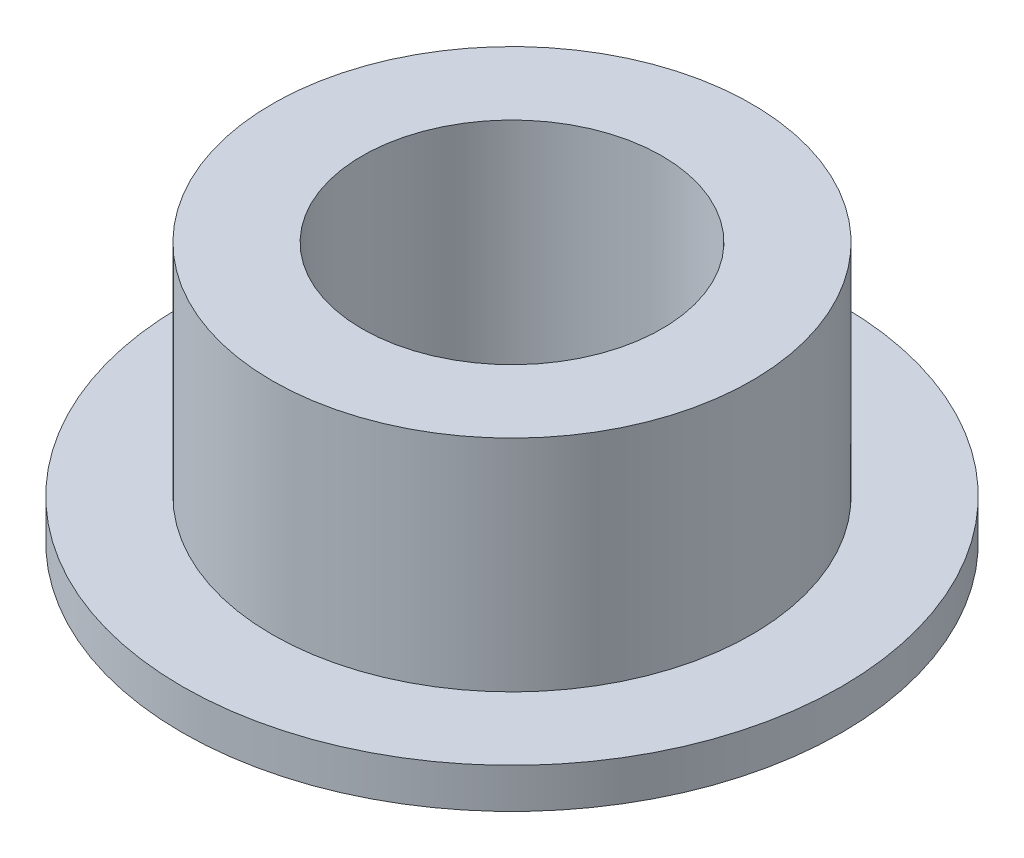
ISO-10303-21;
HEADER;
FILE_DESCRIPTION(('STEP AP214'),'2;1');
FILE_NAME('part.step','',(''),(''),'','','');
FILE_SCHEMA(('AUTOMOTIVE_DESIGN { 1 0 10303 214 1 1 1 1 }'));
ENDSEC;
DATA;
#1=APPLICATION_CONTEXT('core data for automotive mechanical design processes');
#2=APPLICATION_PROTOCOL_DEFINITION('international standard','automotive_design',2000,#1);
#3=PRODUCT_CONTEXT('',#1,'mechanical');
#4=PRODUCT('Part','Part','',(#3));
#5=PRODUCT_RELATED_PRODUCT_CATEGORY('part','',(#4));
#6=PRODUCT_DEFINITION_FORMATION('','',#4);
#7=PRODUCT_DEFINITION_CONTEXT('part definition',#1,'design');
#8=PRODUCT_DEFINITION('design','',#6,#7);
#9=PRODUCT_DEFINITION_SHAPE('','',#8);
#10=(LENGTH_UNIT() NAMED_UNIT(*) SI_UNIT(.MILLI.,.METRE.));
#11=(NAMED_UNIT(*) PLANE_ANGLE_UNIT() SI_UNIT($,.RADIAN.));
#12=(NAMED_UNIT(*) SI_UNIT($,.STERADIAN.) SOLID_ANGLE_UNIT());
#13=UNCERTAINTY_MEASURE_WITH_UNIT(LENGTH_MEASURE(1.E-05),#10,'distance_accuracy_value','');
#14=(GEOMETRIC_REPRESENTATION_CONTEXT(3) GLOBAL_UNCERTAINTY_ASSIGNED_CONTEXT((#13)) GLOBAL_UNIT_ASSIGNED_CONTEXT((#10,
#11,#12)) REPRESENTATION_CONTEXT('',''));
#15=CARTESIAN_POINT('',(0.,0.,0.));
#16=DIRECTION('',(0.,0.,1.));
#17=DIRECTION('',(1.,0.,0.));
#18=AXIS2_PLACEMENT_3D('',#15,#16,#17);
#19=CARTESIAN_POINT('',(0.,2.,0.));
#20=DIRECTION('',(0.,-1.,0.));
#21=DIRECTION('',(0.,0.,-1.));
#22=AXIS2_PLACEMENT_3D('',#19,#20,#21);
#23=CYLINDRICAL_SURFACE('',#22,16.5);
#24=CARTESIAN_POINT('',(0.,2.,0.));
#25=DIRECTION('',(0.,1.,0.));
#26=DIRECTION('',(0.,0.,1.));
#27=AXIS2_PLACEMENT_3D('',#24,#25,#26);
#28=CIRCLE('',#27,16.5);
#29=CARTESIAN_POINT('',(0.,2.,16.5));
#30=VERTEX_POINT('',#29);
#31=EDGE_CURVE('E38',#30,#30,#28,.T.);
#32=ORIENTED_EDGE('',*,*,#31,.F.);
#33=EDGE_LOOP('',(#32));
#34=FACE_BOUND('',#33,.T.);
#35=CARTESIAN_POINT('',(0.,0.,0.));
#36=DIRECTION('',(0.,1.,0.));
#37=DIRECTION('',(0.,0.,1.));
#38=AXIS2_PLACEMENT_3D('',#35,#36,#37);
#39=CIRCLE('',#38,16.5);
#40=CARTESIAN_POINT('',(0.,0.,16.5));
#41=VERTEX_POINT('',#40);
#42=EDGE_CURVE('E34',#41,#41,#39,.T.);
#43=ORIENTED_EDGE('',*,*,#42,.T.);
#44=EDGE_LOOP('',(#43));
#45=FACE_BOUND('',#44,.T.);
#46=ADVANCED_FACE('F31',(#34,#45),#23,.T.);
#47=CARTESIAN_POINT('',(0.,2.,0.));
#48=DIRECTION('',(0.,1.,0.));
#49=DIRECTION('',(0.,0.,1.));
#50=AXIS2_PLACEMENT_3D('',#47,#48,#49);
#51=PLANE('',#50);
#52=CARTESIAN_POINT('',(0.,2.,0.));
#53=DIRECTION('',(0.,1.,0.));
#54=DIRECTION('',(0.,0.,1.));
#55=AXIS2_PLACEMENT_3D('',#52,#53,#54);
#56=CIRCLE('',#55,12.);
#57=CARTESIAN_POINT('',(0.,2.,12.));
#58=VERTEX_POINT('',#57);
#59=EDGE_CURVE('E10',#58,#58,#56,.T.);
#60=ORIENTED_EDGE('',*,*,#59,.F.);
#61=EDGE_LOOP('',(#60));
#62=FACE_BOUND('',#61,.T.);
#63=ORIENTED_EDGE('',*,*,#31,.T.);
#64=EDGE_LOOP('',(#63));
#65=FACE_BOUND('',#64,.T.);
#66=ADVANCED_FACE('F83',(#62,#65),#51,.T.);
#67=CARTESIAN_POINT('',(0.,0.,0.));
#68=DIRECTION('',(0.,1.,0.));
#69=DIRECTION('',(0.,0.,1.));
#70=AXIS2_PLACEMENT_3D('',#67,#68,#69);
#71=PLANE('',#70);
#72=CARTESIAN_POINT('',(0.,0.,0.));
#73=DIRECTION('',(0.,-1.,0.));
#74=DIRECTION('',(0.,0.,-1.));
#75=AXIS2_PLACEMENT_3D('',#72,#73,#74);
#76=CIRCLE('',#75,9.);
#77=CARTESIAN_POINT('',(0.,0.,-9.));
#78=VERTEX_POINT('',#77);
#79=EDGE_CURVE('E48',#78,#78,#76,.T.);
#80=ORIENTED_EDGE('',*,*,#79,.F.);
#81=EDGE_LOOP('',(#80));
#82=FACE_BOUND('',#81,.T.);
#83=ORIENTED_EDGE('',*,*,#42,.F.);
#84=EDGE_LOOP('',(#83));
#85=FACE_BOUND('',#84,.T.);
#86=ADVANCED_FACE('F78',(#82,#85),#71,.F.);
#87=CARTESIAN_POINT('',(0.,13.,0.));
#88=DIRECTION('',(0.,-1.,0.));
#89=DIRECTION('',(0.,0.,-1.));
#90=AXIS2_PLACEMENT_3D('',#87,#88,#89);
#91=CYLINDRICAL_SURFACE('',#90,12.);
#92=CARTESIAN_POINT('',(0.,13.,0.));
#93=DIRECTION('',(0.,1.,0.));
#94=DIRECTION('',(0.,0.,1.));
#95=AXIS2_PLACEMENT_3D('',#92,#93,#94);
#96=CIRCLE('',#95,12.);
#97=CARTESIAN_POINT('',(0.,13.,12.));
#98=VERTEX_POINT('',#97);
#99=EDGE_CURVE('E44',#98,#98,#96,.T.);
#100=ORIENTED_EDGE('',*,*,#99,.F.);
#101=EDGE_LOOP('',(#100));
#102=FACE_BOUND('',#101,.T.);
#103=ORIENTED_EDGE('',*,*,#59,.T.);
#104=EDGE_LOOP('',(#103));
#105=FACE_BOUND('',#104,.T.);
#106=ADVANCED_FACE('F73',(#102,#105),#91,.T.);
#107=CARTESIAN_POINT('',(0.,13.,0.));
#108=DIRECTION('',(0.,1.,0.));
#109=DIRECTION('',(0.,0.,1.));
#110=AXIS2_PLACEMENT_3D('',#107,#108,#109);
#111=PLANE('',#110);
#112=CARTESIAN_POINT('',(0.,13.,0.));
#113=DIRECTION('',(0.,1.,0.));
#114=DIRECTION('',(0.,0.,1.));
#115=AXIS2_PLACEMENT_3D('',#112,#113,#114);
#116=CIRCLE('',#115,7.5);
#117=CARTESIAN_POINT('',(0.,13.,7.5));
#118=VERTEX_POINT('',#117);
#119=EDGE_CURVE('E54',#118,#118,#116,.T.);
#120=ORIENTED_EDGE('',*,*,#119,.F.);
#121=EDGE_LOOP('',(#120));
#122=FACE_BOUND('',#121,.T.);
#123=ORIENTED_EDGE('',*,*,#99,.T.);
#124=EDGE_LOOP('',(#123));
#125=FACE_BOUND('',#124,.T.);
#126=ADVANCED_FACE('F69',(#122,#125),#111,.T.);
#127=CARTESIAN_POINT('',(0.,1.,0.));
#128=DIRECTION('',(0.,-1.,0.));
#129=DIRECTION('',(0.,0.,-1.));
#130=AXIS2_PLACEMENT_3D('',#127,#128,#129);
#131=CYLINDRICAL_SURFACE('',#130,9.);
#132=CARTESIAN_POINT('',(0.,1.,0.));
#133=DIRECTION('',(0.,-1.,0.));
#134=DIRECTION('',(0.,0.,-1.));
#135=AXIS2_PLACEMENT_3D('',#132,#133,#134);
#136=CIRCLE('',#135,9.);
#137=CARTESIAN_POINT('',(0.,1.,-9.));
#138=VERTEX_POINT('',#137);
#139=EDGE_CURVE('E47',#138,#138,#136,.T.);
#140=ORIENTED_EDGE('',*,*,#139,.F.);
#141=EDGE_LOOP('',(#140));
#142=FACE_BOUND('',#141,.T.);
#143=ORIENTED_EDGE('',*,*,#79,.T.);
#144=EDGE_LOOP('',(#143));
#145=FACE_BOUND('',#144,.T.);
#146=ADVANCED_FACE('F72',(#142,#145),#131,.F.);
#147=CARTESIAN_POINT('',(0.,1.,0.));
#148=DIRECTION('',(0.,-1.,0.));
#149=DIRECTION('',(0.,0.,-1.));
#150=AXIS2_PLACEMENT_3D('',#147,#148,#149);
#151=PLANE('',#150);
#152=CARTESIAN_POINT('',(0.,0.999999999999999,0.));
#153=DIRECTION('',(0.,1.,0.));
#154=DIRECTION('',(0.,0.,1.));
#155=AXIS2_PLACEMENT_3D('',#152,#153,#154);
#156=CIRCLE('',#155,7.5);
#157=CARTESIAN_POINT('',(0.,0.999999999999999,7.5));
#158=VERTEX_POINT('',#157);
#159=EDGE_CURVE('E51',#158,#158,#156,.T.);
#160=ORIENTED_EDGE('',*,*,#159,.T.);
#161=EDGE_LOOP('',(#160));
#162=FACE_BOUND('',#161,.T.);
#163=ORIENTED_EDGE('',*,*,#139,.T.);
#164=EDGE_LOOP('',(#163));
#165=FACE_BOUND('',#164,.T.);
#166=ADVANCED_FACE('F60',(#162,#165),#151,.T.);
#167=CARTESIAN_POINT('',(0.,0.999999999999999,0.));
#168=DIRECTION('',(0.,1.,0.));
#169=DIRECTION('',(0.,0.,1.));
#170=AXIS2_PLACEMENT_3D('',#167,#168,#169);
#171=CYLINDRICAL_SURFACE('',#170,7.5);
#172=ORIENTED_EDGE('',*,*,#159,.F.);
#173=EDGE_LOOP('',(#172));
#174=FACE_BOUND('',#173,.T.);
#175=ORIENTED_EDGE('',*,*,#119,.T.);
#176=EDGE_LOOP('',(#175));
#177=FACE_BOUND('',#176,.T.);
#178=ADVANCED_FACE('F63',(#174,#177),#171,.F.);
#179=CLOSED_SHELL('',(#46,#66,#86,#106,#126,#146,#166,#178));
#180=MANIFOLD_SOLID_BREP('B2',#179);
#181=ADVANCED_BREP_SHAPE_REPRESENTATION('',(#18,#180),#14);
#182=SHAPE_DEFINITION_REPRESENTATION(#9,#181);
ENDSEC;
END-ISO-10303-21;
